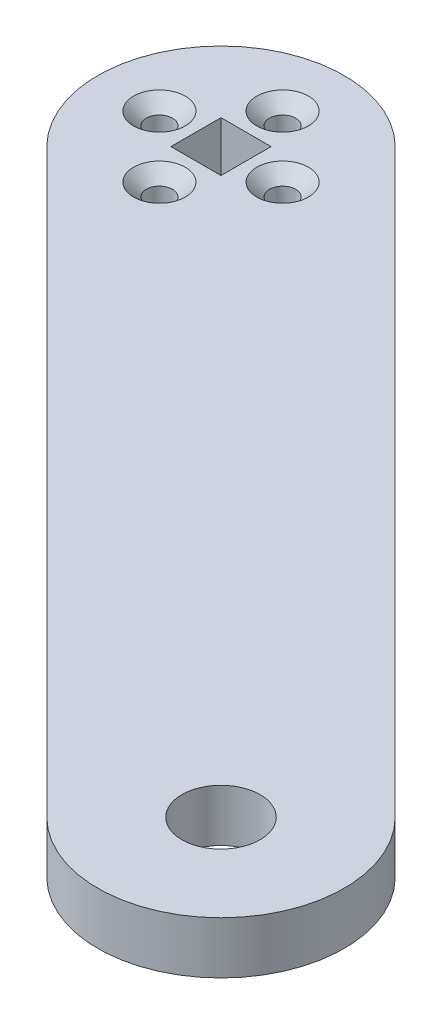
ISO-10303-21;
HEADER;
FILE_DESCRIPTION(('STEP AP214'),'2;1');
FILE_NAME('part.step','',(''),(''),'','','');
FILE_SCHEMA(('AUTOMOTIVE_DESIGN { 1 0 10303 214 1 1 1 1 }'));
ENDSEC;
DATA;
#1=APPLICATION_CONTEXT('core data for automotive mechanical design processes');
#2=APPLICATION_PROTOCOL_DEFINITION('international standard','automotive_design',2000,#1);
#3=PRODUCT_CONTEXT('',#1,'mechanical');
#4=PRODUCT('Part','Part','',(#3));
#5=PRODUCT_RELATED_PRODUCT_CATEGORY('part','',(#4));
#6=PRODUCT_DEFINITION_FORMATION('','',#4);
#7=PRODUCT_DEFINITION_CONTEXT('part definition',#1,'design');
#8=PRODUCT_DEFINITION('design','',#6,#7);
#9=PRODUCT_DEFINITION_SHAPE('','',#8);
#10=(LENGTH_UNIT() NAMED_UNIT(*) SI_UNIT(.MILLI.,.METRE.));
#11=(NAMED_UNIT(*) PLANE_ANGLE_UNIT() SI_UNIT($,.RADIAN.));
#12=(NAMED_UNIT(*) SI_UNIT($,.STERADIAN.) SOLID_ANGLE_UNIT());
#13=UNCERTAINTY_MEASURE_WITH_UNIT(LENGTH_MEASURE(1.E-05),#10,'distance_accuracy_value','');
#14=(GEOMETRIC_REPRESENTATION_CONTEXT(3) GLOBAL_UNCERTAINTY_ASSIGNED_CONTEXT((#13)) GLOBAL_UNIT_ASSIGNED_CONTEXT((#10,
#11,#12)) REPRESENTATION_CONTEXT('',''));
#15=CARTESIAN_POINT('',(0.,0.,0.));
#16=DIRECTION('',(0.,0.,1.));
#17=DIRECTION('',(1.,0.,0.));
#18=AXIS2_PLACEMENT_3D('',#15,#16,#17);
#19=CARTESIAN_POINT('',(0.,-6.35,0.));
#20=DIRECTION('',(0.,1.,0.));
#21=DIRECTION('',(0.,0.,1.));
#22=AXIS2_PLACEMENT_3D('',#19,#20,#21);
#23=CYLINDRICAL_SURFACE('',#22,15.);
#24=CARTESIAN_POINT('',(0.,0.,0.));
#25=DIRECTION('',(0.,1.,0.));
#26=DIRECTION('',(0.,0.,1.));
#27=AXIS2_PLACEMENT_3D('',#24,#25,#26);
#28=CIRCLE('',#27,15.);
#29=CARTESIAN_POINT('',(10.6066017177982,0.,-10.6066017177982));
#30=VERTEX_POINT('',#29);
#31=CARTESIAN_POINT('',(-10.6066017177982,0.,10.6066017177982));
#32=VERTEX_POINT('',#31);
#33=EDGE_CURVE('E152',#30,#32,#28,.T.);
#34=ORIENTED_EDGE('',*,*,#33,.F.);
#35=DIRECTION('',(0.,1.,0.));
#36=VECTOR('',#35,1.);
#37=CARTESIAN_POINT('',(10.6066017177982,-6.35,-10.6066017177982));
#38=LINE('',#37,#36);
#39=CARTESIAN_POINT('',(10.6066017177982,-6.35,-10.6066017177982));
#40=VERTEX_POINT('',#39);
#41=EDGE_CURVE('E11',#40,#30,#38,.T.);
#42=ORIENTED_EDGE('',*,*,#41,.F.);
#43=CARTESIAN_POINT('',(0.,-6.35,0.));
#44=DIRECTION('',(0.,1.,0.));
#45=DIRECTION('',(0.,0.,1.));
#46=AXIS2_PLACEMENT_3D('',#43,#44,#45);
#47=CIRCLE('',#46,15.);
#48=CARTESIAN_POINT('',(-10.6066017177982,-6.35,10.6066017177982));
#49=VERTEX_POINT('',#48);
#50=EDGE_CURVE('E158',#40,#49,#47,.T.);
#51=ORIENTED_EDGE('',*,*,#50,.T.);
#52=DIRECTION('',(0.,1.,0.));
#53=VECTOR('',#52,1.);
#54=CARTESIAN_POINT('',(-10.6066017177982,-6.35,10.6066017177982));
#55=LINE('',#54,#53);
#56=EDGE_CURVE('E42',#49,#32,#55,.T.);
#57=ORIENTED_EDGE('',*,*,#56,.T.);
#58=EDGE_LOOP('',(#34,#42,#51,#57));
#59=FACE_BOUND('',#58,.T.);
#60=ADVANCED_FACE('F39',(#59),#23,.T.);
#61=CARTESIAN_POINT('',(10.6066017177982,-6.35,-10.6066017177982));
#62=DIRECTION('',(0.707106781186549,0.,-0.707106781186546));
#63=DIRECTION('',(-0.707106781186546,0.,-0.707106781186549));
#64=AXIS2_PLACEMENT_3D('',#61,#62,#63);
#65=PLANE('',#64);
#66=DIRECTION('',(-0.707106781186546,0.,-0.707106781186549));
#67=VECTOR('',#66,1.);
#68=CARTESIAN_POINT('',(10.6066017177982,0.,-10.6066017177982));
#69=LINE('',#68,#67);
#70=CARTESIAN_POINT('',(81.3172798364529,0.,60.1040764008567));
#71=VERTEX_POINT('',#70);
#72=EDGE_CURVE('E163',#71,#30,#69,.T.);
#73=ORIENTED_EDGE('',*,*,#72,.F.);
#74=DIRECTION('',(0.,1.,0.));
#75=VECTOR('',#74,1.);
#76=CARTESIAN_POINT('',(81.3172798364529,-6.35,60.1040764008567));
#77=LINE('',#76,#75);
#78=CARTESIAN_POINT('',(81.3172798364529,-6.35,60.1040764008567));
#79=VERTEX_POINT('',#78);
#80=EDGE_CURVE('E48',#79,#71,#77,.T.);
#81=ORIENTED_EDGE('',*,*,#80,.F.);
#82=DIRECTION('',(-0.707106781186546,0.,-0.707106781186549));
#83=VECTOR('',#82,1.);
#84=CARTESIAN_POINT('',(10.6066017177982,-6.35,-10.6066017177982));
#85=LINE('',#84,#83);
#86=EDGE_CURVE('E171',#79,#40,#85,.T.);
#87=ORIENTED_EDGE('',*,*,#86,.T.);
#88=ORIENTED_EDGE('',*,*,#41,.T.);
#89=EDGE_LOOP('',(#73,#81,#87,#88));
#90=FACE_BOUND('',#89,.T.);
#91=ADVANCED_FACE('F205',(#90),#65,.T.);
#92=CARTESIAN_POINT('',(70.7106781186546,-6.35,70.7106781186549));
#93=DIRECTION('',(0.,1.,0.));
#94=DIRECTION('',(0.,0.,1.));
#95=AXIS2_PLACEMENT_3D('',#92,#93,#94);
#96=CYLINDRICAL_SURFACE('',#95,15.);
#97=CARTESIAN_POINT('',(70.7106781186546,0.,70.7106781186549));
#98=DIRECTION('',(0.,1.,0.));
#99=DIRECTION('',(0.,0.,-1.));
#100=AXIS2_PLACEMENT_3D('',#97,#98,#99);
#101=CIRCLE('',#100,15.);
#102=CARTESIAN_POINT('',(60.1040764008564,0.,81.3172798364531));
#103=VERTEX_POINT('',#102);
#104=EDGE_CURVE('E182',#103,#71,#101,.T.);
#105=ORIENTED_EDGE('',*,*,#104,.F.);
#106=DIRECTION('',(0.,1.,0.));
#107=VECTOR('',#106,1.);
#108=CARTESIAN_POINT('',(60.1040764008564,-6.35,81.3172798364531));
#109=LINE('',#108,#107);
#110=CARTESIAN_POINT('',(60.1040764008564,-6.35,81.3172798364531));
#111=VERTEX_POINT('',#110);
#112=EDGE_CURVE('E190',#111,#103,#109,.T.);
#113=ORIENTED_EDGE('',*,*,#112,.F.);
#114=CARTESIAN_POINT('',(70.7106781186546,-6.35,70.7106781186549));
#115=DIRECTION('',(0.,1.,0.));
#116=DIRECTION('',(0.,0.,-1.));
#117=AXIS2_PLACEMENT_3D('',#114,#115,#116);
#118=CIRCLE('',#117,15.);
#119=EDGE_CURVE('E167',#111,#79,#118,.T.);
#120=ORIENTED_EDGE('',*,*,#119,.T.);
#121=ORIENTED_EDGE('',*,*,#80,.T.);
#122=EDGE_LOOP('',(#105,#113,#120,#121));
#123=FACE_BOUND('',#122,.T.);
#124=ADVANCED_FACE('F209',(#123),#96,.T.);
#125=CARTESIAN_POINT('',(-10.6066017177982,-6.35,10.6066017177982));
#126=DIRECTION('',(-0.707106781186549,0.,0.707106781186546));
#127=DIRECTION('',(0.707106781186546,0.,0.707106781186549));
#128=AXIS2_PLACEMENT_3D('',#125,#126,#127);
#129=PLANE('',#128);
#130=DIRECTION('',(0.707106781186546,0.,0.707106781186549));
#131=VECTOR('',#130,1.);
#132=CARTESIAN_POINT('',(-10.6066017177982,0.,10.6066017177982));
#133=LINE('',#132,#131);
#134=EDGE_CURVE('E178',#32,#103,#133,.T.);
#135=ORIENTED_EDGE('',*,*,#134,.F.);
#136=ORIENTED_EDGE('',*,*,#56,.F.);
#137=DIRECTION('',(0.707106781186546,0.,0.707106781186549));
#138=VECTOR('',#137,1.);
#139=CARTESIAN_POINT('',(-10.6066017177982,-6.35,10.6066017177982));
#140=LINE('',#139,#138);
#141=EDGE_CURVE('E162',#49,#111,#140,.T.);
#142=ORIENTED_EDGE('',*,*,#141,.T.);
#143=ORIENTED_EDGE('',*,*,#112,.T.);
#144=EDGE_LOOP('',(#135,#136,#142,#143));
#145=FACE_BOUND('',#144,.T.);
#146=ADVANCED_FACE('F200',(#145),#129,.T.);
#147=CARTESIAN_POINT('',(0.,-6.35,0.));
#148=DIRECTION('',(0.,1.,0.));
#149=DIRECTION('',(0.,0.,1.));
#150=AXIS2_PLACEMENT_3D('',#147,#148,#149);
#151=PLANE('',#150);
#152=CARTESIAN_POINT('',(0.,-6.35,-7.5));
#153=DIRECTION('',(0.,1.,0.));
#154=DIRECTION('',(0.,0.,1.));
#155=AXIS2_PLACEMENT_3D('',#152,#153,#154);
#156=CIRCLE('',#155,1.6);
#157=CARTESIAN_POINT('',(0.,-6.35,-5.9));
#158=VERTEX_POINT('',#157);
#159=EDGE_CURVE('E391',#158,#158,#156,.T.);
#160=ORIENTED_EDGE('',*,*,#159,.T.);
#161=EDGE_LOOP('',(#160));
#162=FACE_BOUND('',#161,.T.);
#163=CARTESIAN_POINT('',(-7.5,-6.35,0.));
#164=DIRECTION('',(0.,1.,0.));
#165=DIRECTION('',(0.,0.,1.));
#166=AXIS2_PLACEMENT_3D('',#163,#164,#165);
#167=CIRCLE('',#166,1.6);
#168=CARTESIAN_POINT('',(-7.5,-6.35,1.6));
#169=VERTEX_POINT('',#168);
#170=EDGE_CURVE('E405',#169,#169,#167,.T.);
#171=ORIENTED_EDGE('',*,*,#170,.T.);
#172=EDGE_LOOP('',(#171));
#173=FACE_BOUND('',#172,.T.);
#174=CARTESIAN_POINT('',(7.5,-6.35,0.));
#175=DIRECTION('',(0.,1.,0.));
#176=DIRECTION('',(0.,0.,1.));
#177=AXIS2_PLACEMENT_3D('',#174,#175,#176);
#178=CIRCLE('',#177,1.6);
#179=CARTESIAN_POINT('',(7.5,-6.35,1.6));
#180=VERTEX_POINT('',#179);
#181=EDGE_CURVE('E417',#180,#180,#178,.T.);
#182=ORIENTED_EDGE('',*,*,#181,.T.);
#183=EDGE_LOOP('',(#182));
#184=FACE_BOUND('',#183,.T.);
#185=CARTESIAN_POINT('',(0.,-6.35,7.5));
#186=DIRECTION('',(0.,1.,0.));
#187=DIRECTION('',(0.,0.,1.));
#188=AXIS2_PLACEMENT_3D('',#185,#186,#187);
#189=CIRCLE('',#188,1.6);
#190=CARTESIAN_POINT('',(0.,-6.35,9.1));
#191=VERTEX_POINT('',#190);
#192=EDGE_CURVE('E429',#191,#191,#189,.T.);
#193=ORIENTED_EDGE('',*,*,#192,.T.);
#194=EDGE_LOOP('',(#193));
#195=FACE_BOUND('',#194,.T.);
#196=CARTESIAN_POINT('',(70.7106781186546,-6.35,70.7106781186549));
#197=DIRECTION('',(0.,1.,0.));
#198=DIRECTION('',(0.,0.,1.));
#199=AXIS2_PLACEMENT_3D('',#196,#197,#198);
#200=CIRCLE('',#199,4.7625);
#201=CARTESIAN_POINT('',(70.7106781186546,-6.35,75.4731781186549));
#202=VERTEX_POINT('',#201);
#203=EDGE_CURVE('E143',#202,#202,#200,.T.);
#204=ORIENTED_EDGE('',*,*,#203,.T.);
#205=EDGE_LOOP('',(#204));
#206=FACE_BOUND('',#205,.T.);
#207=DIRECTION('',(-1.,0.,0.));
#208=VECTOR('',#207,1.);
#209=CARTESIAN_POINT('',(-3.05,-6.35,-3.05));
#210=LINE('',#209,#208);
#211=CARTESIAN_POINT('',(3.05,-6.35,-3.05));
#212=VERTEX_POINT('',#211);
#213=CARTESIAN_POINT('',(-3.05,-6.35,-3.05));
#214=VERTEX_POINT('',#213);
#215=EDGE_CURVE('E114',#212,#214,#210,.T.);
#216=ORIENTED_EDGE('',*,*,#215,.T.);
#217=DIRECTION('',(0.,0.,1.));
#218=VECTOR('',#217,1.);
#219=CARTESIAN_POINT('',(-3.05,-6.35,-3.05));
#220=LINE('',#219,#218);
#221=CARTESIAN_POINT('',(-3.05,-6.35,3.05));
#222=VERTEX_POINT('',#221);
#223=EDGE_CURVE('E107',#214,#222,#220,.T.);
#224=ORIENTED_EDGE('',*,*,#223,.T.);
#225=DIRECTION('',(1.,0.,0.));
#226=VECTOR('',#225,1.);
#227=CARTESIAN_POINT('',(-3.05,-6.35,3.05));
#228=LINE('',#227,#226);
#229=CARTESIAN_POINT('',(3.05,-6.35,3.05));
#230=VERTEX_POINT('',#229);
#231=EDGE_CURVE('E117',#222,#230,#228,.T.);
#232=ORIENTED_EDGE('',*,*,#231,.T.);
#233=DIRECTION('',(0.,0.,-1.));
#234=VECTOR('',#233,1.);
#235=CARTESIAN_POINT('',(3.05,-6.35,-3.05));
#236=LINE('',#235,#234);
#237=EDGE_CURVE('E56',#230,#212,#236,.T.);
#238=ORIENTED_EDGE('',*,*,#237,.T.);
#239=EDGE_LOOP('',(#216,#224,#232,#238));
#240=FACE_BOUND('',#239,.T.);
#241=ORIENTED_EDGE('',*,*,#50,.F.);
#242=ORIENTED_EDGE('',*,*,#86,.F.);
#243=ORIENTED_EDGE('',*,*,#119,.F.);
#244=ORIENTED_EDGE('',*,*,#141,.F.);
#245=EDGE_LOOP('',(#241,#242,#243,#244));
#246=FACE_BOUND('',#245,.T.);
#247=ADVANCED_FACE('F122',(#162,#173,#184,#195,#206,#240,#246),#151,.F.);
#248=CARTESIAN_POINT('',(0.,0.,0.));
#249=DIRECTION('',(0.,1.,0.));
#250=DIRECTION('',(0.,0.,1.));
#251=AXIS2_PLACEMENT_3D('',#248,#249,#250);
#252=PLANE('',#251);
#253=CARTESIAN_POINT('',(0.,0.,-7.5));
#254=DIRECTION('',(0.,1.,0.));
#255=DIRECTION('',(0.,0.,1.));
#256=AXIS2_PLACEMENT_3D('',#253,#254,#255);
#257=CIRCLE('',#256,3.15);
#258=CARTESIAN_POINT('',(0.,0.,-4.35));
#259=VERTEX_POINT('',#258);
#260=EDGE_CURVE('E387',#259,#259,#257,.T.);
#261=ORIENTED_EDGE('',*,*,#260,.F.);
#262=EDGE_LOOP('',(#261));
#263=FACE_BOUND('',#262,.T.);
#264=CARTESIAN_POINT('',(-7.5,0.,0.));
#265=DIRECTION('',(0.,1.,0.));
#266=DIRECTION('',(0.,0.,1.));
#267=AXIS2_PLACEMENT_3D('',#264,#265,#266);
#268=CIRCLE('',#267,3.15);
#269=CARTESIAN_POINT('',(-7.5,0.,3.15));
#270=VERTEX_POINT('',#269);
#271=EDGE_CURVE('E397',#270,#270,#268,.T.);
#272=ORIENTED_EDGE('',*,*,#271,.F.);
#273=EDGE_LOOP('',(#272));
#274=FACE_BOUND('',#273,.T.);
#275=CARTESIAN_POINT('',(7.5,0.,0.));
#276=DIRECTION('',(0.,1.,0.));
#277=DIRECTION('',(0.,0.,1.));
#278=AXIS2_PLACEMENT_3D('',#275,#276,#277);
#279=CIRCLE('',#278,3.15);
#280=CARTESIAN_POINT('',(7.5,0.,3.15));
#281=VERTEX_POINT('',#280);
#282=EDGE_CURVE('E409',#281,#281,#279,.T.);
#283=ORIENTED_EDGE('',*,*,#282,.F.);
#284=EDGE_LOOP('',(#283));
#285=FACE_BOUND('',#284,.T.);
#286=CARTESIAN_POINT('',(0.,0.,7.5));
#287=DIRECTION('',(0.,1.,0.));
#288=DIRECTION('',(0.,0.,1.));
#289=AXIS2_PLACEMENT_3D('',#286,#287,#288);
#290=CIRCLE('',#289,3.15);
#291=CARTESIAN_POINT('',(0.,0.,10.65));
#292=VERTEX_POINT('',#291);
#293=EDGE_CURVE('E421',#292,#292,#290,.T.);
#294=ORIENTED_EDGE('',*,*,#293,.F.);
#295=EDGE_LOOP('',(#294));
#296=FACE_BOUND('',#295,.T.);
#297=CARTESIAN_POINT('',(70.7106781186546,0.,70.7106781186549));
#298=DIRECTION('',(0.,1.,0.));
#299=DIRECTION('',(0.,0.,1.));
#300=AXIS2_PLACEMENT_3D('',#297,#298,#299);
#301=CIRCLE('',#300,4.7625);
#302=CARTESIAN_POINT('',(70.7106781186546,0.,75.4731781186549));
#303=VERTEX_POINT('',#302);
#304=EDGE_CURVE('E133',#303,#303,#301,.T.);
#305=ORIENTED_EDGE('',*,*,#304,.F.);
#306=EDGE_LOOP('',(#305));
#307=FACE_BOUND('',#306,.T.);
#308=DIRECTION('',(0.,0.,1.));
#309=VECTOR('',#308,1.);
#310=CARTESIAN_POINT('',(-3.05,0.,-3.05));
#311=LINE('',#310,#309);
#312=CARTESIAN_POINT('',(-3.05,0.,-3.05));
#313=VERTEX_POINT('',#312);
#314=CARTESIAN_POINT('',(-3.05,0.,3.05));
#315=VERTEX_POINT('',#314);
#316=EDGE_CURVE('E64',#313,#315,#311,.T.);
#317=ORIENTED_EDGE('',*,*,#316,.F.);
#318=DIRECTION('',(-1.,0.,0.));
#319=VECTOR('',#318,1.);
#320=CARTESIAN_POINT('',(-3.05,0.,-3.05));
#321=LINE('',#320,#319);
#322=CARTESIAN_POINT('',(3.05,0.,-3.05));
#323=VERTEX_POINT('',#322);
#324=EDGE_CURVE('E126',#323,#313,#321,.T.);
#325=ORIENTED_EDGE('',*,*,#324,.F.);
#326=DIRECTION('',(0.,0.,-1.));
#327=VECTOR('',#326,1.);
#328=CARTESIAN_POINT('',(3.05,0.,-3.05));
#329=LINE('',#328,#327);
#330=CARTESIAN_POINT('',(3.05,0.,3.05));
#331=VERTEX_POINT('',#330);
#332=EDGE_CURVE('E130',#331,#323,#329,.T.);
#333=ORIENTED_EDGE('',*,*,#332,.F.);
#334=DIRECTION('',(1.,0.,0.));
#335=VECTOR('',#334,1.);
#336=CARTESIAN_POINT('',(-3.05,0.,3.05));
#337=LINE('',#336,#335);
#338=EDGE_CURVE('E142',#315,#331,#337,.T.);
#339=ORIENTED_EDGE('',*,*,#338,.F.);
#340=EDGE_LOOP('',(#317,#325,#333,#339));
#341=FACE_BOUND('',#340,.T.);
#342=ORIENTED_EDGE('',*,*,#33,.T.);
#343=ORIENTED_EDGE('',*,*,#134,.T.);
#344=ORIENTED_EDGE('',*,*,#104,.T.);
#345=ORIENTED_EDGE('',*,*,#72,.T.);
#346=EDGE_LOOP('',(#342,#343,#344,#345));
#347=FACE_BOUND('',#346,.T.);
#348=ADVANCED_FACE('F202',(#263,#274,#285,#296,#307,#341,#347),#252,.T.);
#349=CARTESIAN_POINT('',(-3.05,-6.35,-3.05));
#350=DIRECTION('',(-1.,0.,0.));
#351=DIRECTION('',(0.,0.,1.));
#352=AXIS2_PLACEMENT_3D('',#349,#350,#351);
#353=PLANE('',#352);
#354=ORIENTED_EDGE('',*,*,#316,.T.);
#355=DIRECTION('',(0.,1.,0.));
#356=VECTOR('',#355,1.);
#357=CARTESIAN_POINT('',(-3.05,-6.35,3.05));
#358=LINE('',#357,#356);
#359=EDGE_CURVE('E103',#222,#315,#358,.T.);
#360=ORIENTED_EDGE('',*,*,#359,.F.);
#361=ORIENTED_EDGE('',*,*,#223,.F.);
#362=DIRECTION('',(0.,1.,0.));
#363=VECTOR('',#362,1.);
#364=CARTESIAN_POINT('',(-3.05,-6.35,-3.05));
#365=LINE('',#364,#363);
#366=EDGE_CURVE('E149',#214,#313,#365,.T.);
#367=ORIENTED_EDGE('',*,*,#366,.T.);
#368=EDGE_LOOP('',(#354,#360,#361,#367));
#369=FACE_BOUND('',#368,.T.);
#370=ADVANCED_FACE('F105',(#369),#353,.F.);
#371=CARTESIAN_POINT('',(-3.05,-6.35,-3.05));
#372=DIRECTION('',(0.,0.,-1.));
#373=DIRECTION('',(-1.,0.,0.));
#374=AXIS2_PLACEMENT_3D('',#371,#372,#373);
#375=PLANE('',#374);
#376=ORIENTED_EDGE('',*,*,#324,.T.);
#377=ORIENTED_EDGE('',*,*,#366,.F.);
#378=ORIENTED_EDGE('',*,*,#215,.F.);
#379=DIRECTION('',(0.,1.,0.));
#380=VECTOR('',#379,1.);
#381=CARTESIAN_POINT('',(3.05,-6.35,-3.05));
#382=LINE('',#381,#380);
#383=EDGE_CURVE('E153',#212,#323,#382,.T.);
#384=ORIENTED_EDGE('',*,*,#383,.T.);
#385=EDGE_LOOP('',(#376,#377,#378,#384));
#386=FACE_BOUND('',#385,.T.);
#387=ADVANCED_FACE('F245',(#386),#375,.F.);
#388=CARTESIAN_POINT('',(3.05,-6.35,-3.05));
#389=DIRECTION('',(1.,0.,0.));
#390=DIRECTION('',(0.,0.,-1.));
#391=AXIS2_PLACEMENT_3D('',#388,#389,#390);
#392=PLANE('',#391);
#393=ORIENTED_EDGE('',*,*,#332,.T.);
#394=ORIENTED_EDGE('',*,*,#383,.F.);
#395=ORIENTED_EDGE('',*,*,#237,.F.);
#396=DIRECTION('',(0.,1.,0.));
#397=VECTOR('',#396,1.);
#398=CARTESIAN_POINT('',(3.05,-6.35,3.05));
#399=LINE('',#398,#397);
#400=EDGE_CURVE('E113',#230,#331,#399,.T.);
#401=ORIENTED_EDGE('',*,*,#400,.T.);
#402=EDGE_LOOP('',(#393,#394,#395,#401));
#403=FACE_BOUND('',#402,.T.);
#404=ADVANCED_FACE('F256',(#403),#392,.F.);
#405=CARTESIAN_POINT('',(-3.05,-6.35,3.05));
#406=DIRECTION('',(0.,0.,1.));
#407=DIRECTION('',(1.,0.,0.));
#408=AXIS2_PLACEMENT_3D('',#405,#406,#407);
#409=PLANE('',#408);
#410=ORIENTED_EDGE('',*,*,#338,.T.);
#411=ORIENTED_EDGE('',*,*,#400,.F.);
#412=ORIENTED_EDGE('',*,*,#231,.F.);
#413=ORIENTED_EDGE('',*,*,#359,.T.);
#414=EDGE_LOOP('',(#410,#411,#412,#413));
#415=FACE_BOUND('',#414,.T.);
#416=ADVANCED_FACE('F118',(#415),#409,.F.);
#417=CARTESIAN_POINT('',(70.7106781186546,-6.35,70.7106781186549));
#418=DIRECTION('',(0.,1.,0.));
#419=DIRECTION('',(0.,0.,1.));
#420=AXIS2_PLACEMENT_3D('',#417,#418,#419);
#421=CYLINDRICAL_SURFACE('',#420,4.7625);
#422=ORIENTED_EDGE('',*,*,#203,.F.);
#423=EDGE_LOOP('',(#422));
#424=FACE_BOUND('',#423,.T.);
#425=ORIENTED_EDGE('',*,*,#304,.T.);
#426=EDGE_LOOP('',(#425));
#427=FACE_BOUND('',#426,.T.);
#428=ADVANCED_FACE('F274',(#424,#427),#421,.F.);
#429=CARTESIAN_POINT('',(0.,0.,7.5));
#430=DIRECTION('',(0.,1.,0.));
#431=DIRECTION('',(0.,0.,1.));
#432=AXIS2_PLACEMENT_3D('',#429,#430,#431);
#433=CYLINDRICAL_SURFACE('',#432,1.6);
#434=ORIENTED_EDGE('',*,*,#192,.F.);
#435=EDGE_LOOP('',(#434));
#436=FACE_BOUND('',#435,.T.);
#437=CARTESIAN_POINT('',(0.,-1.55,7.5));
#438=DIRECTION('',(0.,1.,0.));
#439=DIRECTION('',(0.,0.,1.));
#440=AXIS2_PLACEMENT_3D('',#437,#438,#439);
#441=CIRCLE('',#440,1.6);
#442=CARTESIAN_POINT('',(0.,-1.55,9.1));
#443=VERTEX_POINT('',#442);
#444=EDGE_CURVE('E425',#443,#443,#441,.T.);
#445=ORIENTED_EDGE('',*,*,#444,.T.);
#446=EDGE_LOOP('',(#445));
#447=FACE_BOUND('',#446,.T.);
#448=ADVANCED_FACE('F283',(#436,#447),#433,.F.);
#449=CARTESIAN_POINT('',(0.,0.,7.5));
#450=DIRECTION('',(0.,1.,0.));
#451=DIRECTION('',(0.,0.,1.));
#452=AXIS2_PLACEMENT_3D('',#449,#450,#451);
#453=CONICAL_SURFACE('',#452,3.15,0.785398163397448);
#454=ORIENTED_EDGE('',*,*,#444,.F.);
#455=EDGE_LOOP('',(#454));
#456=FACE_BOUND('',#455,.T.);
#457=ORIENTED_EDGE('',*,*,#293,.T.);
#458=EDGE_LOOP('',(#457));
#459=FACE_BOUND('',#458,.T.);
#460=ADVANCED_FACE('F307',(#456,#459),#453,.F.);
#461=CARTESIAN_POINT('',(7.5,0.,0.));
#462=DIRECTION('',(0.,1.,0.));
#463=DIRECTION('',(0.,0.,1.));
#464=AXIS2_PLACEMENT_3D('',#461,#462,#463);
#465=CYLINDRICAL_SURFACE('',#464,1.6);
#466=ORIENTED_EDGE('',*,*,#181,.F.);
#467=EDGE_LOOP('',(#466));
#468=FACE_BOUND('',#467,.T.);
#469=CARTESIAN_POINT('',(7.5,-1.55,0.));
#470=DIRECTION('',(0.,1.,0.));
#471=DIRECTION('',(0.,0.,1.));
#472=AXIS2_PLACEMENT_3D('',#469,#470,#471);
#473=CIRCLE('',#472,1.6);
#474=CARTESIAN_POINT('',(7.5,-1.55,1.6));
#475=VERTEX_POINT('',#474);
#476=EDGE_CURVE('E413',#475,#475,#473,.T.);
#477=ORIENTED_EDGE('',*,*,#476,.T.);
#478=EDGE_LOOP('',(#477));
#479=FACE_BOUND('',#478,.T.);
#480=ADVANCED_FACE('F317',(#468,#479),#465,.F.);
#481=CARTESIAN_POINT('',(7.5,0.,0.));
#482=DIRECTION('',(0.,1.,0.));
#483=DIRECTION('',(0.,0.,1.));
#484=AXIS2_PLACEMENT_3D('',#481,#482,#483);
#485=CONICAL_SURFACE('',#484,3.15,0.785398163397448);
#486=ORIENTED_EDGE('',*,*,#476,.F.);
#487=EDGE_LOOP('',(#486));
#488=FACE_BOUND('',#487,.T.);
#489=ORIENTED_EDGE('',*,*,#282,.T.);
#490=EDGE_LOOP('',(#489));
#491=FACE_BOUND('',#490,.T.);
#492=ADVANCED_FACE('F327',(#488,#491),#485,.F.);
#493=CARTESIAN_POINT('',(-7.5,0.,0.));
#494=DIRECTION('',(0.,1.,0.));
#495=DIRECTION('',(0.,0.,1.));
#496=AXIS2_PLACEMENT_3D('',#493,#494,#495);
#497=CYLINDRICAL_SURFACE('',#496,1.6);
#498=ORIENTED_EDGE('',*,*,#170,.F.);
#499=EDGE_LOOP('',(#498));
#500=FACE_BOUND('',#499,.T.);
#501=CARTESIAN_POINT('',(-7.5,-1.55,0.));
#502=DIRECTION('',(0.,1.,0.));
#503=DIRECTION('',(0.,0.,1.));
#504=AXIS2_PLACEMENT_3D('',#501,#502,#503);
#505=CIRCLE('',#504,1.6);
#506=CARTESIAN_POINT('',(-7.5,-1.55,1.6));
#507=VERTEX_POINT('',#506);
#508=EDGE_CURVE('E401',#507,#507,#505,.T.);
#509=ORIENTED_EDGE('',*,*,#508,.T.);
#510=EDGE_LOOP('',(#509));
#511=FACE_BOUND('',#510,.T.);
#512=ADVANCED_FACE('F337',(#500,#511),#497,.F.);
#513=CARTESIAN_POINT('',(-7.5,0.,0.));
#514=DIRECTION('',(0.,1.,0.));
#515=DIRECTION('',(0.,0.,1.));
#516=AXIS2_PLACEMENT_3D('',#513,#514,#515);
#517=CONICAL_SURFACE('',#516,3.15,0.785398163397448);
#518=ORIENTED_EDGE('',*,*,#508,.F.);
#519=EDGE_LOOP('',(#518));
#520=FACE_BOUND('',#519,.T.);
#521=ORIENTED_EDGE('',*,*,#271,.T.);
#522=EDGE_LOOP('',(#521));
#523=FACE_BOUND('',#522,.T.);
#524=ADVANCED_FACE('F347',(#520,#523),#517,.F.);
#525=CARTESIAN_POINT('',(0.,0.,-7.5));
#526=DIRECTION('',(0.,1.,0.));
#527=DIRECTION('',(0.,0.,1.));
#528=AXIS2_PLACEMENT_3D('',#525,#526,#527);
#529=CYLINDRICAL_SURFACE('',#528,1.6);
#530=ORIENTED_EDGE('',*,*,#159,.F.);
#531=EDGE_LOOP('',(#530));
#532=FACE_BOUND('',#531,.T.);
#533=CARTESIAN_POINT('',(0.,-1.55,-7.5));
#534=DIRECTION('',(0.,1.,0.));
#535=DIRECTION('',(0.,0.,1.));
#536=AXIS2_PLACEMENT_3D('',#533,#534,#535);
#537=CIRCLE('',#536,1.6);
#538=CARTESIAN_POINT('',(0.,-1.55,-5.9));
#539=VERTEX_POINT('',#538);
#540=EDGE_CURVE('E384',#539,#539,#537,.T.);
#541=ORIENTED_EDGE('',*,*,#540,.T.);
#542=EDGE_LOOP('',(#541));
#543=FACE_BOUND('',#542,.T.);
#544=ADVANCED_FACE('F357',(#532,#543),#529,.F.);
#545=CARTESIAN_POINT('',(0.,0.,-7.5));
#546=DIRECTION('',(0.,1.,0.));
#547=DIRECTION('',(0.,0.,1.));
#548=AXIS2_PLACEMENT_3D('',#545,#546,#547);
#549=CONICAL_SURFACE('',#548,3.15,0.785398163397448);
#550=ORIENTED_EDGE('',*,*,#540,.F.);
#551=EDGE_LOOP('',(#550));
#552=FACE_BOUND('',#551,.T.);
#553=ORIENTED_EDGE('',*,*,#260,.T.);
#554=EDGE_LOOP('',(#553));
#555=FACE_BOUND('',#554,.T.);
#556=ADVANCED_FACE('F367',(#552,#555),#549,.F.);
#557=CLOSED_SHELL('',(#60,#91,#124,#146,#247,#348,#370,#387,#404,#416,#428,#448,#460,#480,#492,
#512,#524,#544,#556));
#558=MANIFOLD_SOLID_BREP('B2',#557);
#559=ADVANCED_BREP_SHAPE_REPRESENTATION('',(#18,#558),#14);
#560=SHAPE_DEFINITION_REPRESENTATION(#9,#559);
ENDSEC;
END-ISO-10303-21;
